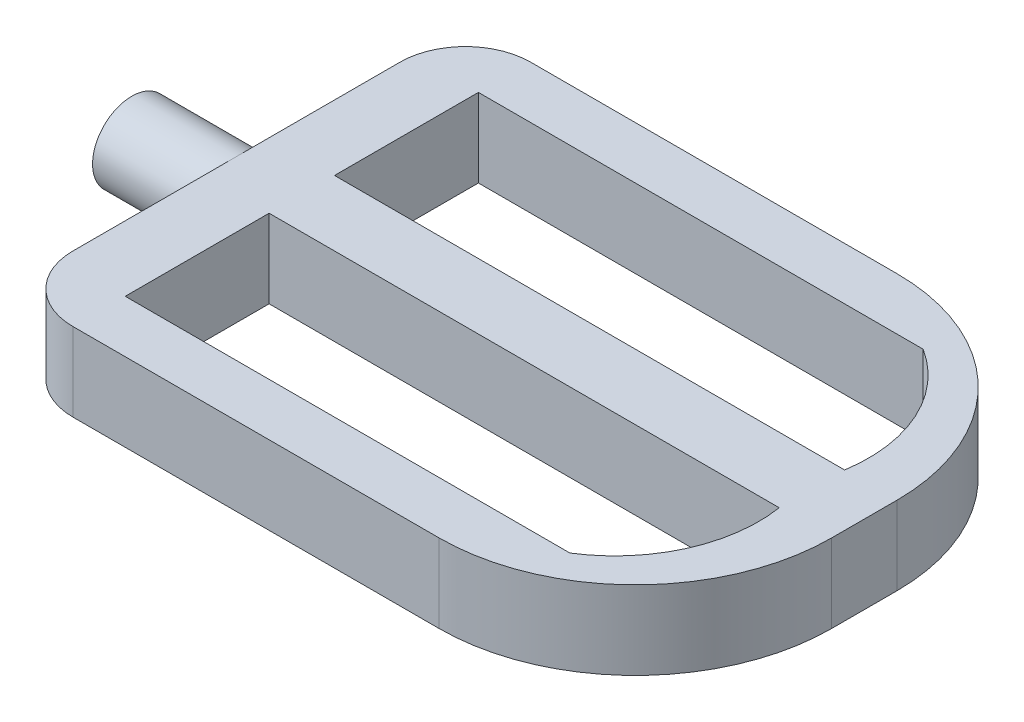
ISO-10303-21;
HEADER;
FILE_DESCRIPTION(('STEP AP214'),'2;1');
FILE_NAME('part.step','',(''),(''),'','','');
FILE_SCHEMA(('AUTOMOTIVE_DESIGN { 1 0 10303 214 1 1 1 1 }'));
ENDSEC;
DATA;
#1=APPLICATION_CONTEXT('core data for automotive mechanical design processes');
#2=APPLICATION_PROTOCOL_DEFINITION('international standard','automotive_design',2000,#1);
#3=PRODUCT_CONTEXT('',#1,'mechanical');
#4=PRODUCT('Part','Part','',(#3));
#5=PRODUCT_RELATED_PRODUCT_CATEGORY('part','',(#4));
#6=PRODUCT_DEFINITION_FORMATION('','',#4);
#7=PRODUCT_DEFINITION_CONTEXT('part definition',#1,'design');
#8=PRODUCT_DEFINITION('design','',#6,#7);
#9=PRODUCT_DEFINITION_SHAPE('','',#8);
#10=(LENGTH_UNIT() NAMED_UNIT(*) SI_UNIT(.MILLI.,.METRE.));
#11=(NAMED_UNIT(*) PLANE_ANGLE_UNIT() SI_UNIT($,.RADIAN.));
#12=(NAMED_UNIT(*) SI_UNIT($,.STERADIAN.) SOLID_ANGLE_UNIT());
#13=UNCERTAINTY_MEASURE_WITH_UNIT(LENGTH_MEASURE(1.E-05),#10,'distance_accuracy_value','');
#14=(GEOMETRIC_REPRESENTATION_CONTEXT(3) GLOBAL_UNCERTAINTY_ASSIGNED_CONTEXT((#13)) GLOBAL_UNIT_ASSIGNED_CONTEXT((#10,
#11,#12)) REPRESENTATION_CONTEXT('',''));
#15=CARTESIAN_POINT('',(0.,0.,0.));
#16=DIRECTION('',(0.,0.,1.));
#17=DIRECTION('',(1.,0.,0.));
#18=AXIS2_PLACEMENT_3D('',#15,#16,#17);
#19=CARTESIAN_POINT('',(37.5,-80.,0.));
#20=DIRECTION('',(-1.,0.,0.));
#21=DIRECTION('',(0.,0.,1.));
#22=AXIS2_PLACEMENT_3D('',#19,#20,#21);
#23=CYLINDRICAL_SURFACE('',#22,3.00000000000001);
#24=CARTESIAN_POINT('',(37.5,-80.,0.));
#25=DIRECTION('',(-1.,0.,0.));
#26=DIRECTION('',(0.,0.,1.));
#27=AXIS2_PLACEMENT_3D('',#24,#25,#26);
#28=CIRCLE('',#27,3.00000000000001);
#29=CARTESIAN_POINT('',(37.5,-77.,0.));
#30=VERTEX_POINT('',#29);
#31=CARTESIAN_POINT('',(37.5,-83.,0.));
#32=VERTEX_POINT('',#31);
#33=EDGE_CURVE('E252',#30,#32,#28,.T.);
#34=ORIENTED_EDGE('',*,*,#33,.T.);
#35=EDGE_CURVE('E256',#32,#30,#28,.T.);
#36=ORIENTED_EDGE('',*,*,#35,.T.);
#37=EDGE_LOOP('',(#34,#36));
#38=FACE_BOUND('',#37,.T.);
#39=CARTESIAN_POINT('',(29.5,-80.,0.));
#40=DIRECTION('',(-1.,0.,0.));
#41=DIRECTION('',(0.,0.,1.));
#42=AXIS2_PLACEMENT_3D('',#39,#40,#41);
#43=CIRCLE('',#42,3.00000000000001);
#44=CARTESIAN_POINT('',(29.5,-80.,3.00000000000001));
#45=VERTEX_POINT('',#44);
#46=EDGE_CURVE('E251',#45,#45,#43,.T.);
#47=ORIENTED_EDGE('',*,*,#46,.F.);
#48=EDGE_LOOP('',(#47));
#49=FACE_BOUND('',#48,.T.);
#50=ADVANCED_FACE('F39',(#38,#49),#23,.T.);
#51=CARTESIAN_POINT('',(29.5,-80.,0.));
#52=DIRECTION('',(-1.,0.,0.));
#53=DIRECTION('',(0.,0.,1.));
#54=AXIS2_PLACEMENT_3D('',#51,#52,#53);
#55=PLANE('',#54);
#56=ORIENTED_EDGE('',*,*,#46,.T.);
#57=EDGE_LOOP('',(#56));
#58=FACE_BOUND('',#57,.T.);
#59=ADVANCED_FACE('F347',(#58),#55,.T.);
#60=CARTESIAN_POINT('',(37.5,0.,0.));
#61=DIRECTION('',(1.,0.,0.));
#62=DIRECTION('',(0.,0.,-1.));
#63=AXIS2_PLACEMENT_3D('',#60,#61,#62);
#64=PLANE('',#63);
#65=DIRECTION('',(0.,0.,1.));
#66=VECTOR('',#65,1.);
#67=CARTESIAN_POINT('',(37.5,-77.,17.5));
#68=LINE('',#67,#66);
#69=CARTESIAN_POINT('',(37.5,-77.,-12.5));
#70=VERTEX_POINT('',#69);
#71=EDGE_CURVE('E232',#70,#30,#68,.T.);
#72=ORIENTED_EDGE('',*,*,#71,.F.);
#73=DIRECTION('',(0.,1.,0.));
#74=VECTOR('',#73,1.);
#75=CARTESIAN_POINT('',(37.5,0.,-12.5));
#76=LINE('',#75,#74);
#77=CARTESIAN_POINT('',(37.5,-83.,-12.5));
#78=VERTEX_POINT('',#77);
#79=EDGE_CURVE('E11',#70,#78,#76,.F.);
#80=ORIENTED_EDGE('',*,*,#79,.T.);
#81=DIRECTION('',(0.,0.,-1.));
#82=VECTOR('',#81,1.);
#83=CARTESIAN_POINT('',(37.5,-83.,17.5));
#84=LINE('',#83,#82);
#85=EDGE_CURVE('E227',#32,#78,#84,.T.);
#86=ORIENTED_EDGE('',*,*,#85,.F.);
#87=ORIENTED_EDGE('',*,*,#33,.F.);
#88=EDGE_LOOP('',(#72,#80,#86,#87));
#89=FACE_BOUND('',#88,.T.);
#90=ADVANCED_FACE('F316',(#89),#64,.F.);
#91=CARTESIAN_POINT('',(85.5,-77.,17.5));
#92=DIRECTION('',(0.,0.,-1.));
#93=DIRECTION('',(-1.,0.,0.));
#94=AXIS2_PLACEMENT_3D('',#91,#92,#93);
#95=PLANE('',#94);
#96=DIRECTION('',(-1.,0.,0.));
#97=VECTOR('',#96,1.);
#98=CARTESIAN_POINT('',(85.5,-77.,17.5));
#99=LINE('',#98,#97);
#100=CARTESIAN_POINT('',(70.5,-77.,17.5));
#101=VERTEX_POINT('',#100);
#102=CARTESIAN_POINT('',(42.5,-77.,17.5));
#103=VERTEX_POINT('',#102);
#104=EDGE_CURVE('E235',#101,#103,#99,.T.);
#105=ORIENTED_EDGE('',*,*,#104,.T.);
#106=DIRECTION('',(0.,-1.,0.));
#107=VECTOR('',#106,1.);
#108=CARTESIAN_POINT('',(42.5,-77.,17.5));
#109=LINE('',#108,#107);
#110=CARTESIAN_POINT('',(42.5,-83.,17.5));
#111=VERTEX_POINT('',#110);
#112=EDGE_CURVE('E276',#103,#111,#109,.T.);
#113=ORIENTED_EDGE('',*,*,#112,.T.);
#114=DIRECTION('',(-1.,0.,0.));
#115=VECTOR('',#114,1.);
#116=CARTESIAN_POINT('',(85.5,-83.,17.5));
#117=LINE('',#116,#115);
#118=CARTESIAN_POINT('',(70.5,-83.,17.5));
#119=VERTEX_POINT('',#118);
#120=EDGE_CURVE('E248',#119,#111,#117,.T.);
#121=ORIENTED_EDGE('',*,*,#120,.F.);
#122=DIRECTION('',(0.,-1.,0.));
#123=VECTOR('',#122,1.);
#124=CARTESIAN_POINT('',(70.5,-77.,17.5));
#125=LINE('',#124,#123);
#126=EDGE_CURVE('E268',#119,#101,#125,.F.);
#127=ORIENTED_EDGE('',*,*,#126,.T.);
#128=EDGE_LOOP('',(#105,#113,#121,#127));
#129=FACE_BOUND('',#128,.T.);
#130=ADVANCED_FACE('F332',(#129),#95,.F.);
#131=CARTESIAN_POINT('',(85.5,-83.,17.5));
#132=DIRECTION('',(0.,1.,0.));
#133=DIRECTION('',(0.,0.,1.));
#134=AXIS2_PLACEMENT_3D('',#131,#132,#133);
#135=PLANE('',#134);
#136=DIRECTION('',(1.,0.,0.));
#137=VECTOR('',#136,1.);
#138=CARTESIAN_POINT('',(85.5,-83.,-2.5));
#139=LINE('',#138,#137);
#140=CARTESIAN_POINT('',(42.5,-83.,-2.5));
#141=VERTEX_POINT('',#140);
#142=CARTESIAN_POINT('',(81.5,-83.,-2.5));
#143=VERTEX_POINT('',#142);
#144=EDGE_CURVE('E221',#141,#143,#139,.T.);
#145=ORIENTED_EDGE('',*,*,#144,.T.);
#146=CARTESIAN_POINT('',(70.6315579754767,-83.,-4.19616271612576));
#147=DIRECTION('',(0.,1.,0.));
#148=DIRECTION('',(0.,0.,1.));
#149=AXIS2_PLACEMENT_3D('',#146,#147,#148);
#150=CIRCLE('',#149,11.);
#151=CARTESIAN_POINT('',(76.5,-83.,-13.5));
#152=VERTEX_POINT('',#151);
#153=EDGE_CURVE('E224',#143,#152,#150,.T.);
#154=ORIENTED_EDGE('',*,*,#153,.T.);
#155=DIRECTION('',(-1.,0.,0.));
#156=VECTOR('',#155,1.);
#157=CARTESIAN_POINT('',(85.5,-83.,-13.5));
#158=LINE('',#157,#156);
#159=CARTESIAN_POINT('',(42.5,-83.,-13.5));
#160=VERTEX_POINT('',#159);
#161=EDGE_CURVE('E218',#152,#160,#158,.T.);
#162=ORIENTED_EDGE('',*,*,#161,.T.);
#163=DIRECTION('',(0.,0.,1.));
#164=VECTOR('',#163,1.);
#165=CARTESIAN_POINT('',(42.5,-83.,17.5));
#166=LINE('',#165,#164);
#167=EDGE_CURVE('E162',#160,#141,#166,.T.);
#168=ORIENTED_EDGE('',*,*,#167,.T.);
#169=EDGE_LOOP('',(#145,#154,#162,#168));
#170=FACE_BOUND('',#169,.T.);
#171=DIRECTION('',(1.,0.,0.));
#172=VECTOR('',#171,1.);
#173=CARTESIAN_POINT('',(85.5,-83.,13.5));
#174=LINE('',#173,#172);
#175=CARTESIAN_POINT('',(42.5,-83.,13.5));
#176=VERTEX_POINT('',#175);
#177=CARTESIAN_POINT('',(76.5,-83.,13.5));
#178=VERTEX_POINT('',#177);
#179=EDGE_CURVE('E212',#176,#178,#174,.T.);
#180=ORIENTED_EDGE('',*,*,#179,.T.);
#181=CARTESIAN_POINT('',(70.6315579754767,-83.,4.19616271612576));
#182=DIRECTION('',(0.,1.,0.));
#183=DIRECTION('',(0.,0.,1.));
#184=AXIS2_PLACEMENT_3D('',#181,#182,#183);
#185=CIRCLE('',#184,11.);
#186=CARTESIAN_POINT('',(81.5,-83.,2.5));
#187=VERTEX_POINT('',#186);
#188=EDGE_CURVE('E215',#178,#187,#185,.T.);
#189=ORIENTED_EDGE('',*,*,#188,.T.);
#190=DIRECTION('',(-1.,0.,0.));
#191=VECTOR('',#190,1.);
#192=CARTESIAN_POINT('',(85.5,-83.,2.5));
#193=LINE('',#192,#191);
#194=CARTESIAN_POINT('',(42.5,-83.,2.5));
#195=VERTEX_POINT('',#194);
#196=EDGE_CURVE('E186',#187,#195,#193,.T.);
#197=ORIENTED_EDGE('',*,*,#196,.T.);
#198=DIRECTION('',(0.,0.,1.));
#199=VECTOR('',#198,1.);
#200=CARTESIAN_POINT('',(42.5,-83.,17.5));
#201=LINE('',#200,#199);
#202=EDGE_CURVE('E209',#195,#176,#201,.T.);
#203=ORIENTED_EDGE('',*,*,#202,.T.);
#204=EDGE_LOOP('',(#180,#189,#197,#203));
#205=FACE_BOUND('',#204,.T.);
#206=ORIENTED_EDGE('',*,*,#120,.T.);
#207=CARTESIAN_POINT('',(42.5,-83.,12.5));
#208=DIRECTION('',(0.,1.,0.));
#209=DIRECTION('',(0.,0.,1.));
#210=AXIS2_PLACEMENT_3D('',#207,#208,#209);
#211=CIRCLE('',#210,5.);
#212=CARTESIAN_POINT('',(37.5,-83.,12.5));
#213=VERTEX_POINT('',#212);
#214=EDGE_CURVE('E281',#111,#213,#211,.F.);
#215=ORIENTED_EDGE('',*,*,#214,.T.);
#216=EDGE_CURVE('E236',#213,#32,#84,.T.);
#217=ORIENTED_EDGE('',*,*,#216,.T.);
#218=ORIENTED_EDGE('',*,*,#85,.T.);
#219=CARTESIAN_POINT('',(42.5,-83.,-12.5));
#220=DIRECTION('',(0.,1.,0.));
#221=DIRECTION('',(0.,0.,1.));
#222=AXIS2_PLACEMENT_3D('',#219,#220,#221);
#223=CIRCLE('',#222,5.);
#224=CARTESIAN_POINT('',(42.5,-83.,-17.5));
#225=VERTEX_POINT('',#224);
#226=EDGE_CURVE('E279',#78,#225,#223,.F.);
#227=ORIENTED_EDGE('',*,*,#226,.T.);
#228=DIRECTION('',(-1.,0.,0.));
#229=VECTOR('',#228,1.);
#230=CARTESIAN_POINT('',(85.5,-83.,-17.5));
#231=LINE('',#230,#229);
#232=CARTESIAN_POINT('',(70.5,-83.,-17.5));
#233=VERTEX_POINT('',#232);
#234=EDGE_CURVE('E245',#233,#225,#231,.T.);
#235=ORIENTED_EDGE('',*,*,#234,.F.);
#236=CARTESIAN_POINT('',(70.5,-83.,-2.5));
#237=DIRECTION('',(0.,1.,0.));
#238=DIRECTION('',(0.,0.,1.));
#239=AXIS2_PLACEMENT_3D('',#236,#237,#238);
#240=CIRCLE('',#239,15.);
#241=CARTESIAN_POINT('',(85.5,-83.,-2.5));
#242=VERTEX_POINT('',#241);
#243=EDGE_CURVE('E264',#233,#242,#240,.F.);
#244=ORIENTED_EDGE('',*,*,#243,.T.);
#245=DIRECTION('',(0.,0.,-1.));
#246=VECTOR('',#245,1.);
#247=CARTESIAN_POINT('',(85.5,-83.,17.5));
#248=LINE('',#247,#246);
#249=CARTESIAN_POINT('',(85.5,-83.,2.5));
#250=VERTEX_POINT('',#249);
#251=EDGE_CURVE('E228',#250,#242,#248,.T.);
#252=ORIENTED_EDGE('',*,*,#251,.F.);
#253=CARTESIAN_POINT('',(70.5,-83.,2.5));
#254=DIRECTION('',(0.,1.,0.));
#255=DIRECTION('',(0.,0.,1.));
#256=AXIS2_PLACEMENT_3D('',#253,#254,#255);
#257=CIRCLE('',#256,15.);
#258=EDGE_CURVE('E266',#250,#119,#257,.F.);
#259=ORIENTED_EDGE('',*,*,#258,.T.);
#260=EDGE_LOOP('',(#206,#215,#217,#218,#227,#235,#244,#252,#259));
#261=FACE_BOUND('',#260,.T.);
#262=ADVANCED_FACE('F310',(#170,#205,#261),#135,.F.);
#263=CARTESIAN_POINT('',(85.5,-77.,-17.5));
#264=DIRECTION('',(0.,0.,1.));
#265=DIRECTION('',(1.,0.,0.));
#266=AXIS2_PLACEMENT_3D('',#263,#264,#265);
#267=PLANE('',#266);
#268=ORIENTED_EDGE('',*,*,#234,.T.);
#269=DIRECTION('',(0.,1.,0.));
#270=VECTOR('',#269,1.);
#271=CARTESIAN_POINT('',(42.5,-77.,-17.5));
#272=LINE('',#271,#270);
#273=CARTESIAN_POINT('',(42.5,-77.,-17.5));
#274=VERTEX_POINT('',#273);
#275=EDGE_CURVE('E47',#225,#274,#272,.T.);
#276=ORIENTED_EDGE('',*,*,#275,.T.);
#277=DIRECTION('',(-1.,0.,0.));
#278=VECTOR('',#277,1.);
#279=CARTESIAN_POINT('',(85.5,-77.,-17.5));
#280=LINE('',#279,#278);
#281=CARTESIAN_POINT('',(70.5,-77.,-17.5));
#282=VERTEX_POINT('',#281);
#283=EDGE_CURVE('E242',#282,#274,#280,.T.);
#284=ORIENTED_EDGE('',*,*,#283,.F.);
#285=DIRECTION('',(0.,1.,0.));
#286=VECTOR('',#285,1.);
#287=CARTESIAN_POINT('',(70.5,-83.,-17.5));
#288=LINE('',#287,#286);
#289=EDGE_CURVE('E274',#282,#233,#288,.F.);
#290=ORIENTED_EDGE('',*,*,#289,.T.);
#291=EDGE_LOOP('',(#268,#276,#284,#290));
#292=FACE_BOUND('',#291,.T.);
#293=ADVANCED_FACE('F292',(#292),#267,.F.);
#294=CARTESIAN_POINT('',(85.5,-77.,17.5));
#295=DIRECTION('',(0.,-1.,0.));
#296=DIRECTION('',(0.,0.,-1.));
#297=AXIS2_PLACEMENT_3D('',#294,#295,#296);
#298=PLANE('',#297);
#299=DIRECTION('',(-1.,0.,0.));
#300=VECTOR('',#299,1.);
#301=CARTESIAN_POINT('',(42.5,-77.,-13.5));
#302=LINE('',#301,#300);
#303=CARTESIAN_POINT('',(76.5,-77.,-13.5));
#304=VERTEX_POINT('',#303);
#305=CARTESIAN_POINT('',(42.5,-77.,-13.5));
#306=VERTEX_POINT('',#305);
#307=EDGE_CURVE('E169',#304,#306,#302,.T.);
#308=ORIENTED_EDGE('',*,*,#307,.F.);
#309=CARTESIAN_POINT('',(70.6315579754767,-77.,-4.19616271612576));
#310=DIRECTION('',(0.,1.,0.));
#311=DIRECTION('',(0.,0.,1.));
#312=AXIS2_PLACEMENT_3D('',#309,#310,#311);
#313=CIRCLE('',#312,11.);
#314=CARTESIAN_POINT('',(81.5,-77.,-2.5));
#315=VERTEX_POINT('',#314);
#316=EDGE_CURVE('E174',#315,#304,#313,.T.);
#317=ORIENTED_EDGE('',*,*,#316,.F.);
#318=DIRECTION('',(1.,0.,0.));
#319=VECTOR('',#318,1.);
#320=CARTESIAN_POINT('',(81.5,-77.,-2.5));
#321=LINE('',#320,#319);
#322=CARTESIAN_POINT('',(42.5,-77.,-2.5));
#323=VERTEX_POINT('',#322);
#324=EDGE_CURVE('E179',#323,#315,#321,.T.);
#325=ORIENTED_EDGE('',*,*,#324,.F.);
#326=DIRECTION('',(0.,0.,1.));
#327=VECTOR('',#326,1.);
#328=CARTESIAN_POINT('',(42.5,-77.,-2.5));
#329=LINE('',#328,#327);
#330=EDGE_CURVE('E159',#306,#323,#329,.T.);
#331=ORIENTED_EDGE('',*,*,#330,.F.);
#332=EDGE_LOOP('',(#308,#317,#325,#331));
#333=FACE_BOUND('',#332,.T.);
#334=DIRECTION('',(-1.,0.,0.));
#335=VECTOR('',#334,1.);
#336=CARTESIAN_POINT('',(81.5,-77.,2.5));
#337=LINE('',#336,#335);
#338=CARTESIAN_POINT('',(81.5,-77.,2.5));
#339=VERTEX_POINT('',#338);
#340=CARTESIAN_POINT('',(42.5,-77.,2.5));
#341=VERTEX_POINT('',#340);
#342=EDGE_CURVE('E203',#339,#341,#337,.T.);
#343=ORIENTED_EDGE('',*,*,#342,.F.);
#344=CARTESIAN_POINT('',(70.6315579754767,-77.,4.19616271612576));
#345=DIRECTION('',(0.,1.,0.));
#346=DIRECTION('',(0.,0.,1.));
#347=AXIS2_PLACEMENT_3D('',#344,#345,#346);
#348=CIRCLE('',#347,11.);
#349=CARTESIAN_POINT('',(76.5,-77.,13.5));
#350=VERTEX_POINT('',#349);
#351=EDGE_CURVE('E205',#350,#339,#348,.T.);
#352=ORIENTED_EDGE('',*,*,#351,.F.);
#353=DIRECTION('',(1.,0.,0.));
#354=VECTOR('',#353,1.);
#355=CARTESIAN_POINT('',(42.5,-77.,13.5));
#356=LINE('',#355,#354);
#357=CARTESIAN_POINT('',(42.5,-77.,13.5));
#358=VERTEX_POINT('',#357);
#359=EDGE_CURVE('E192',#358,#350,#356,.T.);
#360=ORIENTED_EDGE('',*,*,#359,.F.);
#361=DIRECTION('',(0.,0.,1.));
#362=VECTOR('',#361,1.);
#363=CARTESIAN_POINT('',(42.5,-77.,2.5));
#364=LINE('',#363,#362);
#365=EDGE_CURVE('E200',#341,#358,#364,.T.);
#366=ORIENTED_EDGE('',*,*,#365,.F.);
#367=EDGE_LOOP('',(#343,#352,#360,#366));
#368=FACE_BOUND('',#367,.T.);
#369=CARTESIAN_POINT('',(37.5,-77.,12.5));
#370=VERTEX_POINT('',#369);
#371=EDGE_CURVE('E238',#30,#370,#68,.T.);
#372=ORIENTED_EDGE('',*,*,#371,.T.);
#373=CARTESIAN_POINT('',(42.5,-77.,12.5));
#374=DIRECTION('',(0.,-1.,0.));
#375=DIRECTION('',(0.,0.,-1.));
#376=AXIS2_PLACEMENT_3D('',#373,#374,#375);
#377=CIRCLE('',#376,5.);
#378=EDGE_CURVE('E287',#370,#103,#377,.F.);
#379=ORIENTED_EDGE('',*,*,#378,.T.);
#380=ORIENTED_EDGE('',*,*,#104,.F.);
#381=CARTESIAN_POINT('',(70.5,-77.,2.5));
#382=DIRECTION('',(0.,-1.,0.));
#383=DIRECTION('',(0.,0.,-1.));
#384=AXIS2_PLACEMENT_3D('',#381,#382,#383);
#385=CIRCLE('',#384,15.);
#386=CARTESIAN_POINT('',(85.5,-77.,2.5));
#387=VERTEX_POINT('',#386);
#388=EDGE_CURVE('E272',#101,#387,#385,.F.);
#389=ORIENTED_EDGE('',*,*,#388,.T.);
#390=DIRECTION('',(0.,0.,1.));
#391=VECTOR('',#390,1.);
#392=CARTESIAN_POINT('',(85.5,-77.,17.5));
#393=LINE('',#392,#391);
#394=CARTESIAN_POINT('',(85.5,-77.,-2.5));
#395=VERTEX_POINT('',#394);
#396=EDGE_CURVE('E231',#395,#387,#393,.T.);
#397=ORIENTED_EDGE('',*,*,#396,.F.);
#398=CARTESIAN_POINT('',(70.5,-77.,-2.5));
#399=DIRECTION('',(0.,-1.,0.));
#400=DIRECTION('',(0.,0.,-1.));
#401=AXIS2_PLACEMENT_3D('',#398,#399,#400);
#402=CIRCLE('',#401,15.);
#403=EDGE_CURVE('E270',#395,#282,#402,.F.);
#404=ORIENTED_EDGE('',*,*,#403,.T.);
#405=ORIENTED_EDGE('',*,*,#283,.T.);
#406=CARTESIAN_POINT('',(42.5,-77.,-12.5));
#407=DIRECTION('',(0.,-1.,0.));
#408=DIRECTION('',(0.,0.,-1.));
#409=AXIS2_PLACEMENT_3D('',#406,#407,#408);
#410=CIRCLE('',#409,5.);
#411=EDGE_CURVE('E285',#274,#70,#410,.F.);
#412=ORIENTED_EDGE('',*,*,#411,.T.);
#413=ORIENTED_EDGE('',*,*,#71,.T.);
#414=EDGE_LOOP('',(#372,#379,#380,#389,#397,#404,#405,#412,#413));
#415=FACE_BOUND('',#414,.T.);
#416=ADVANCED_FACE('F176',(#333,#368,#415),#298,.F.);
#417=CARTESIAN_POINT('',(85.5,0.,0.));
#418=DIRECTION('',(1.,0.,0.));
#419=DIRECTION('',(0.,0.,-1.));
#420=AXIS2_PLACEMENT_3D('',#417,#418,#419);
#421=PLANE('',#420);
#422=ORIENTED_EDGE('',*,*,#396,.T.);
#423=DIRECTION('',(0.,-1.,0.));
#424=VECTOR('',#423,1.);
#425=CARTESIAN_POINT('',(85.5,-83.,2.5));
#426=LINE('',#425,#424);
#427=EDGE_CURVE('E261',#387,#250,#426,.T.);
#428=ORIENTED_EDGE('',*,*,#427,.T.);
#429=ORIENTED_EDGE('',*,*,#251,.T.);
#430=DIRECTION('',(0.,1.,0.));
#431=VECTOR('',#430,1.);
#432=CARTESIAN_POINT('',(85.5,-77.,-2.5));
#433=LINE('',#432,#431);
#434=EDGE_CURVE('E255',#242,#395,#433,.T.);
#435=ORIENTED_EDGE('',*,*,#434,.T.);
#436=EDGE_LOOP('',(#422,#428,#429,#435));
#437=FACE_BOUND('',#436,.T.);
#438=ADVANCED_FACE('F306',(#437),#421,.T.);
#439=ORIENTED_EDGE('',*,*,#216,.F.);
#440=DIRECTION('',(0.,-1.,0.));
#441=VECTOR('',#440,1.);
#442=CARTESIAN_POINT('',(37.5,0.,12.5));
#443=LINE('',#442,#441);
#444=EDGE_CURVE('E283',#213,#370,#443,.F.);
#445=ORIENTED_EDGE('',*,*,#444,.T.);
#446=ORIENTED_EDGE('',*,*,#371,.F.);
#447=ORIENTED_EDGE('',*,*,#35,.F.);
#448=EDGE_LOOP('',(#439,#445,#446,#447));
#449=FACE_BOUND('',#448,.T.);
#450=ADVANCED_FACE('F324',(#449),#64,.F.);
#451=CARTESIAN_POINT('',(70.5,0.,2.5));
#452=DIRECTION('',(0.,1.,0.));
#453=DIRECTION('',(0.,0.,1.));
#454=AXIS2_PLACEMENT_3D('',#451,#452,#453);
#455=CYLINDRICAL_SURFACE('',#454,15.);
#456=ORIENTED_EDGE('',*,*,#388,.F.);
#457=ORIENTED_EDGE('',*,*,#126,.F.);
#458=ORIENTED_EDGE('',*,*,#258,.F.);
#459=ORIENTED_EDGE('',*,*,#427,.F.);
#460=EDGE_LOOP('',(#456,#457,#458,#459));
#461=FACE_BOUND('',#460,.T.);
#462=ADVANCED_FACE('F335',(#461),#455,.T.);
#463=CARTESIAN_POINT('',(70.5,0.,-2.5));
#464=DIRECTION('',(0.,-1.,0.));
#465=DIRECTION('',(0.,0.,-1.));
#466=AXIS2_PLACEMENT_3D('',#463,#464,#465);
#467=CYLINDRICAL_SURFACE('',#466,15.);
#468=ORIENTED_EDGE('',*,*,#243,.F.);
#469=ORIENTED_EDGE('',*,*,#289,.F.);
#470=ORIENTED_EDGE('',*,*,#403,.F.);
#471=ORIENTED_EDGE('',*,*,#434,.F.);
#472=EDGE_LOOP('',(#468,#469,#470,#471));
#473=FACE_BOUND('',#472,.T.);
#474=ADVANCED_FACE('F304',(#473),#467,.T.);
#475=CARTESIAN_POINT('',(42.5,-77.,12.5));
#476=DIRECTION('',(0.,-1.,0.));
#477=DIRECTION('',(0.,0.,-1.));
#478=AXIS2_PLACEMENT_3D('',#475,#476,#477);
#479=CYLINDRICAL_SURFACE('',#478,5.);
#480=ORIENTED_EDGE('',*,*,#378,.F.);
#481=ORIENTED_EDGE('',*,*,#444,.F.);
#482=ORIENTED_EDGE('',*,*,#214,.F.);
#483=ORIENTED_EDGE('',*,*,#112,.F.);
#484=EDGE_LOOP('',(#480,#481,#482,#483));
#485=FACE_BOUND('',#484,.T.);
#486=ADVANCED_FACE('F327',(#485),#479,.T.);
#487=CARTESIAN_POINT('',(42.5,-77.,-12.5));
#488=DIRECTION('',(0.,1.,0.));
#489=DIRECTION('',(0.,0.,1.));
#490=AXIS2_PLACEMENT_3D('',#487,#488,#489);
#491=CYLINDRICAL_SURFACE('',#490,5.);
#492=ORIENTED_EDGE('',*,*,#226,.F.);
#493=ORIENTED_EDGE('',*,*,#79,.F.);
#494=ORIENTED_EDGE('',*,*,#411,.F.);
#495=ORIENTED_EDGE('',*,*,#275,.F.);
#496=EDGE_LOOP('',(#492,#493,#494,#495));
#497=FACE_BOUND('',#496,.T.);
#498=ADVANCED_FACE('F41',(#497),#491,.T.);
#499=CARTESIAN_POINT('',(70.6315579754767,-125.,4.19616271612576));
#500=DIRECTION('',(0.,1.,0.));
#501=DIRECTION('',(0.,0.,1.));
#502=AXIS2_PLACEMENT_3D('',#499,#500,#501);
#503=CYLINDRICAL_SURFACE('',#502,11.);
#504=DIRECTION('',(0.,1.,0.));
#505=VECTOR('',#504,1.);
#506=CARTESIAN_POINT('',(76.5,-125.,13.5));
#507=LINE('',#506,#505);
#508=EDGE_CURVE('E196',#178,#350,#507,.T.);
#509=ORIENTED_EDGE('',*,*,#508,.T.);
#510=ORIENTED_EDGE('',*,*,#351,.T.);
#511=DIRECTION('',(0.,1.,0.));
#512=VECTOR('',#511,1.);
#513=CARTESIAN_POINT('',(81.5,-125.,2.5));
#514=LINE('',#513,#512);
#515=EDGE_CURVE('E189',#187,#339,#514,.T.);
#516=ORIENTED_EDGE('',*,*,#515,.F.);
#517=ORIENTED_EDGE('',*,*,#188,.F.);
#518=EDGE_LOOP('',(#509,#510,#516,#517));
#519=FACE_BOUND('',#518,.T.);
#520=ADVANCED_FACE('F372',(#519),#503,.F.);
#521=CARTESIAN_POINT('',(42.5,-125.,13.5));
#522=DIRECTION('',(0.,0.,1.));
#523=DIRECTION('',(1.,0.,0.));
#524=AXIS2_PLACEMENT_3D('',#521,#522,#523);
#525=PLANE('',#524);
#526=DIRECTION('',(0.,1.,0.));
#527=VECTOR('',#526,1.);
#528=CARTESIAN_POINT('',(42.5,-125.,13.5));
#529=LINE('',#528,#527);
#530=EDGE_CURVE('E194',#176,#358,#529,.T.);
#531=ORIENTED_EDGE('',*,*,#530,.T.);
#532=ORIENTED_EDGE('',*,*,#359,.T.);
#533=ORIENTED_EDGE('',*,*,#508,.F.);
#534=ORIENTED_EDGE('',*,*,#179,.F.);
#535=EDGE_LOOP('',(#531,#532,#533,#534));
#536=FACE_BOUND('',#535,.T.);
#537=ADVANCED_FACE('F368',(#536),#525,.F.);
#538=CARTESIAN_POINT('',(42.5,-125.,2.5));
#539=DIRECTION('',(-1.,0.,0.));
#540=DIRECTION('',(0.,0.,1.));
#541=AXIS2_PLACEMENT_3D('',#538,#539,#540);
#542=PLANE('',#541);
#543=DIRECTION('',(0.,1.,0.));
#544=VECTOR('',#543,1.);
#545=CARTESIAN_POINT('',(42.5,-125.,2.5));
#546=LINE('',#545,#544);
#547=EDGE_CURVE('E62',#195,#341,#546,.T.);
#548=ORIENTED_EDGE('',*,*,#547,.T.);
#549=ORIENTED_EDGE('',*,*,#365,.T.);
#550=ORIENTED_EDGE('',*,*,#530,.F.);
#551=ORIENTED_EDGE('',*,*,#202,.F.);
#552=EDGE_LOOP('',(#548,#549,#550,#551));
#553=FACE_BOUND('',#552,.T.);
#554=ADVANCED_FACE('F371',(#553),#542,.F.);
#555=CARTESIAN_POINT('',(81.5,-125.,2.5));
#556=DIRECTION('',(0.,0.,-1.));
#557=DIRECTION('',(-1.,0.,0.));
#558=AXIS2_PLACEMENT_3D('',#555,#556,#557);
#559=PLANE('',#558);
#560=ORIENTED_EDGE('',*,*,#515,.T.);
#561=ORIENTED_EDGE('',*,*,#342,.T.);
#562=ORIENTED_EDGE('',*,*,#547,.F.);
#563=ORIENTED_EDGE('',*,*,#196,.F.);
#564=EDGE_LOOP('',(#560,#561,#562,#563));
#565=FACE_BOUND('',#564,.T.);
#566=ADVANCED_FACE('F376',(#565),#559,.F.);
#567=CARTESIAN_POINT('',(70.6315579754767,-125.,-4.19616271612576));
#568=DIRECTION('',(0.,1.,0.));
#569=DIRECTION('',(0.,0.,1.));
#570=AXIS2_PLACEMENT_3D('',#567,#568,#569);
#571=CYLINDRICAL_SURFACE('',#570,11.);
#572=DIRECTION('',(0.,1.,0.));
#573=VECTOR('',#572,1.);
#574=CARTESIAN_POINT('',(81.5,-125.,-2.5));
#575=LINE('',#574,#573);
#576=EDGE_CURVE('E184',#143,#315,#575,.T.);
#577=ORIENTED_EDGE('',*,*,#576,.T.);
#578=ORIENTED_EDGE('',*,*,#316,.T.);
#579=DIRECTION('',(0.,1.,0.));
#580=VECTOR('',#579,1.);
#581=CARTESIAN_POINT('',(76.5,-125.,-13.5));
#582=LINE('',#581,#580);
#583=EDGE_CURVE('E165',#152,#304,#582,.T.);
#584=ORIENTED_EDGE('',*,*,#583,.F.);
#585=ORIENTED_EDGE('',*,*,#153,.F.);
#586=EDGE_LOOP('',(#577,#578,#584,#585));
#587=FACE_BOUND('',#586,.T.);
#588=ADVANCED_FACE('F380',(#587),#571,.F.);
#589=CARTESIAN_POINT('',(81.5,-125.,-2.5));
#590=DIRECTION('',(0.,0.,1.));
#591=DIRECTION('',(1.,0.,0.));
#592=AXIS2_PLACEMENT_3D('',#589,#590,#591);
#593=PLANE('',#592);
#594=DIRECTION('',(0.,1.,0.));
#595=VECTOR('',#594,1.);
#596=CARTESIAN_POINT('',(42.5,-125.,-2.5));
#597=LINE('',#596,#595);
#598=EDGE_CURVE('E164',#141,#323,#597,.T.);
#599=ORIENTED_EDGE('',*,*,#598,.T.);
#600=ORIENTED_EDGE('',*,*,#324,.T.);
#601=ORIENTED_EDGE('',*,*,#576,.F.);
#602=ORIENTED_EDGE('',*,*,#144,.F.);
#603=EDGE_LOOP('',(#599,#600,#601,#602));
#604=FACE_BOUND('',#603,.T.);
#605=ADVANCED_FACE('F386',(#604),#593,.F.);
#606=CARTESIAN_POINT('',(42.5,-125.,-2.5));
#607=DIRECTION('',(-1.,0.,0.));
#608=DIRECTION('',(0.,0.,1.));
#609=AXIS2_PLACEMENT_3D('',#606,#607,#608);
#610=PLANE('',#609);
#611=DIRECTION('',(0.,1.,0.));
#612=VECTOR('',#611,1.);
#613=CARTESIAN_POINT('',(42.5,-125.,-13.5));
#614=LINE('',#613,#612);
#615=EDGE_CURVE('E54',#160,#306,#614,.T.);
#616=ORIENTED_EDGE('',*,*,#615,.T.);
#617=ORIENTED_EDGE('',*,*,#330,.T.);
#618=ORIENTED_EDGE('',*,*,#598,.F.);
#619=ORIENTED_EDGE('',*,*,#167,.F.);
#620=EDGE_LOOP('',(#616,#617,#618,#619));
#621=FACE_BOUND('',#620,.T.);
#622=ADVANCED_FACE('F156',(#621),#610,.F.);
#623=CARTESIAN_POINT('',(42.5,-125.,-13.5));
#624=DIRECTION('',(0.,0.,-1.));
#625=DIRECTION('',(-1.,0.,0.));
#626=AXIS2_PLACEMENT_3D('',#623,#624,#625);
#627=PLANE('',#626);
#628=ORIENTED_EDGE('',*,*,#583,.T.);
#629=ORIENTED_EDGE('',*,*,#307,.T.);
#630=ORIENTED_EDGE('',*,*,#615,.F.);
#631=ORIENTED_EDGE('',*,*,#161,.F.);
#632=EDGE_LOOP('',(#628,#629,#630,#631));
#633=FACE_BOUND('',#632,.T.);
#634=ADVANCED_FACE('F170',(#633),#627,.F.);
#635=CLOSED_SHELL('',(#50,#59,#90,#130,#262,#293,#416,#438,#450,#462,#474,#486,#498,#520,#537,
#554,#566,#588,#605,#622,#634));
#636=MANIFOLD_SOLID_BREP('B2',#635);
#637=ADVANCED_BREP_SHAPE_REPRESENTATION('',(#18,#636),#14);
#638=SHAPE_DEFINITION_REPRESENTATION(#9,#637);
ENDSEC;
END-ISO-10303-21;
